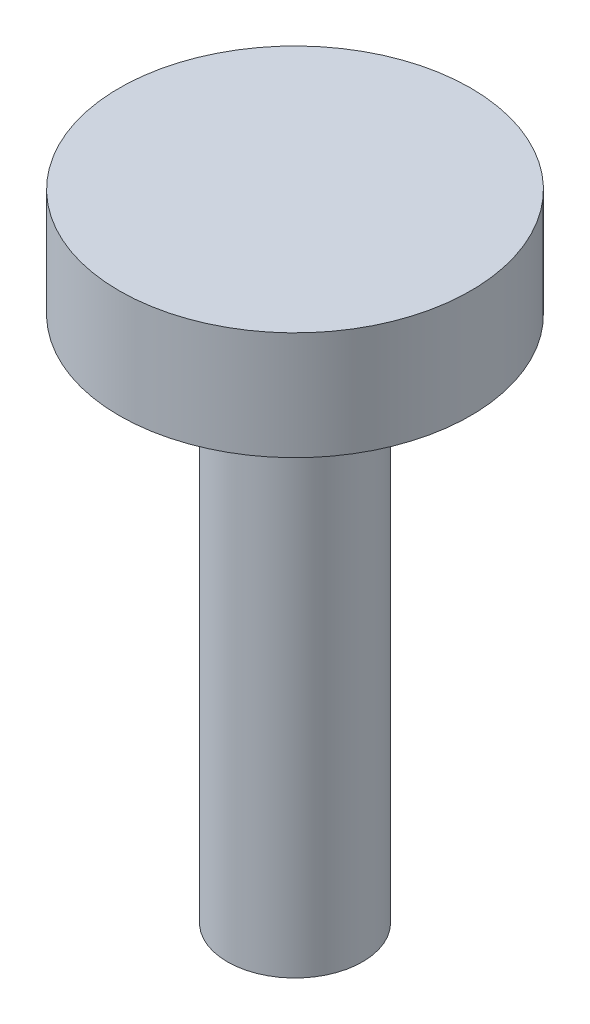
ISO-10303-21;
HEADER;
FILE_DESCRIPTION(('STEP AP214'),'2;1');
FILE_NAME('part.step','',(''),(''),'','','');
FILE_SCHEMA(('AUTOMOTIVE_DESIGN { 1 0 10303 214 1 1 1 1 }'));
ENDSEC;
DATA;
#1=APPLICATION_CONTEXT('core data for automotive mechanical design processes');
#2=APPLICATION_PROTOCOL_DEFINITION('international standard','automotive_design',2000,#1);
#3=PRODUCT_CONTEXT('',#1,'mechanical');
#4=PRODUCT('Part','Part','',(#3));
#5=PRODUCT_RELATED_PRODUCT_CATEGORY('part','',(#4));
#6=PRODUCT_DEFINITION_FORMATION('','',#4);
#7=PRODUCT_DEFINITION_CONTEXT('part definition',#1,'design');
#8=PRODUCT_DEFINITION('design','',#6,#7);
#9=PRODUCT_DEFINITION_SHAPE('','',#8);
#10=(LENGTH_UNIT() NAMED_UNIT(*) SI_UNIT(.MILLI.,.METRE.));
#11=(NAMED_UNIT(*) PLANE_ANGLE_UNIT() SI_UNIT($,.RADIAN.));
#12=(NAMED_UNIT(*) SI_UNIT($,.STERADIAN.) SOLID_ANGLE_UNIT());
#13=UNCERTAINTY_MEASURE_WITH_UNIT(LENGTH_MEASURE(1.E-05),#10,'distance_accuracy_value','');
#14=(GEOMETRIC_REPRESENTATION_CONTEXT(3) GLOBAL_UNCERTAINTY_ASSIGNED_CONTEXT((#13)) GLOBAL_UNIT_ASSIGNED_CONTEXT((#10,
#11,#12)) REPRESENTATION_CONTEXT('',''));
#15=CARTESIAN_POINT('',(0.,0.,0.));
#16=DIRECTION('',(0.,0.,1.));
#17=DIRECTION('',(1.,0.,0.));
#18=AXIS2_PLACEMENT_3D('',#15,#16,#17);
#19=CARTESIAN_POINT('',(0.,7.8,0.));
#20=DIRECTION('',(0.,-1.,0.));
#21=DIRECTION('',(0.,0.,-1.));
#22=AXIS2_PLACEMENT_3D('',#19,#20,#21);
#23=CYLINDRICAL_SURFACE('',#22,1.);
#24=CARTESIAN_POINT('',(0.,7.8,0.));
#25=DIRECTION('',(0.,1.,0.));
#26=DIRECTION('',(0.,0.,1.));
#27=AXIS2_PLACEMENT_3D('',#24,#25,#26);
#28=CIRCLE('',#27,1.);
#29=CARTESIAN_POINT('',(0.,7.8,1.));
#30=VERTEX_POINT('',#29);
#31=EDGE_CURVE('E10',#30,#30,#28,.T.);
#32=ORIENTED_EDGE('',*,*,#31,.F.);
#33=EDGE_LOOP('',(#32));
#34=FACE_BOUND('',#33,.T.);
#35=CARTESIAN_POINT('',(0.,0.,0.));
#36=DIRECTION('',(0.,1.,0.));
#37=DIRECTION('',(0.,0.,1.));
#38=AXIS2_PLACEMENT_3D('',#35,#36,#37);
#39=CIRCLE('',#38,1.);
#40=CARTESIAN_POINT('',(0.,0.,1.));
#41=VERTEX_POINT('',#40);
#42=EDGE_CURVE('E38',#41,#41,#39,.T.);
#43=ORIENTED_EDGE('',*,*,#42,.T.);
#44=EDGE_LOOP('',(#43));
#45=FACE_BOUND('',#44,.T.);
#46=ADVANCED_FACE('F35',(#34,#45),#23,.T.);
#47=CARTESIAN_POINT('',(0.,0.,0.));
#48=DIRECTION('',(0.,1.,0.));
#49=DIRECTION('',(0.,0.,1.));
#50=AXIS2_PLACEMENT_3D('',#47,#48,#49);
#51=PLANE('',#50);
#52=ORIENTED_EDGE('',*,*,#42,.F.);
#53=EDGE_LOOP('',(#52));
#54=FACE_BOUND('',#53,.T.);
#55=ADVANCED_FACE('F58',(#54),#51,.F.);
#56=CARTESIAN_POINT('',(0.,9.4,0.));
#57=DIRECTION('',(0.,-1.,0.));
#58=DIRECTION('',(0.,0.,-1.));
#59=AXIS2_PLACEMENT_3D('',#56,#57,#58);
#60=CYLINDRICAL_SURFACE('',#59,2.6);
#61=CARTESIAN_POINT('',(0.,9.4,0.));
#62=DIRECTION('',(0.,1.,0.));
#63=DIRECTION('',(0.,0.,1.));
#64=AXIS2_PLACEMENT_3D('',#61,#62,#63);
#65=CIRCLE('',#64,2.6);
#66=CARTESIAN_POINT('',(0.,9.4,2.6));
#67=VERTEX_POINT('',#66);
#68=EDGE_CURVE('E45',#67,#67,#65,.T.);
#69=ORIENTED_EDGE('',*,*,#68,.F.);
#70=EDGE_LOOP('',(#69));
#71=FACE_BOUND('',#70,.T.);
#72=CARTESIAN_POINT('',(0.,7.8,0.));
#73=DIRECTION('',(0.,1.,0.));
#74=DIRECTION('',(0.,0.,1.));
#75=AXIS2_PLACEMENT_3D('',#72,#73,#74);
#76=CIRCLE('',#75,2.6);
#77=CARTESIAN_POINT('',(0.,7.8,2.6));
#78=VERTEX_POINT('',#77);
#79=EDGE_CURVE('E47',#78,#78,#76,.T.);
#80=ORIENTED_EDGE('',*,*,#79,.T.);
#81=EDGE_LOOP('',(#80));
#82=FACE_BOUND('',#81,.T.);
#83=ADVANCED_FACE('F55',(#71,#82),#60,.T.);
#84=CARTESIAN_POINT('',(0.,9.4,0.));
#85=DIRECTION('',(0.,1.,0.));
#86=DIRECTION('',(0.,0.,1.));
#87=AXIS2_PLACEMENT_3D('',#84,#85,#86);
#88=PLANE('',#87);
#89=ORIENTED_EDGE('',*,*,#68,.T.);
#90=EDGE_LOOP('',(#89));
#91=FACE_BOUND('',#90,.T.);
#92=ADVANCED_FACE('F53',(#91),#88,.T.);
#93=CARTESIAN_POINT('',(0.,7.8,0.));
#94=DIRECTION('',(0.,1.,0.));
#95=DIRECTION('',(0.,0.,1.));
#96=AXIS2_PLACEMENT_3D('',#93,#94,#95);
#97=PLANE('',#96);
#98=ORIENTED_EDGE('',*,*,#31,.T.);
#99=EDGE_LOOP('',(#98));
#100=FACE_BOUND('',#99,.T.);
#101=ORIENTED_EDGE('',*,*,#79,.F.);
#102=EDGE_LOOP('',(#101));
#103=FACE_BOUND('',#102,.T.);
#104=ADVANCED_FACE('F62',(#100,#103),#97,.F.);
#105=CLOSED_SHELL('',(#46,#55,#83,#92,#104));
#106=MANIFOLD_SOLID_BREP('B2',#105);
#107=ADVANCED_BREP_SHAPE_REPRESENTATION('',(#18,#106),#14);
#108=SHAPE_DEFINITION_REPRESENTATION(#9,#107);
ENDSEC;
END-ISO-10303-21;
